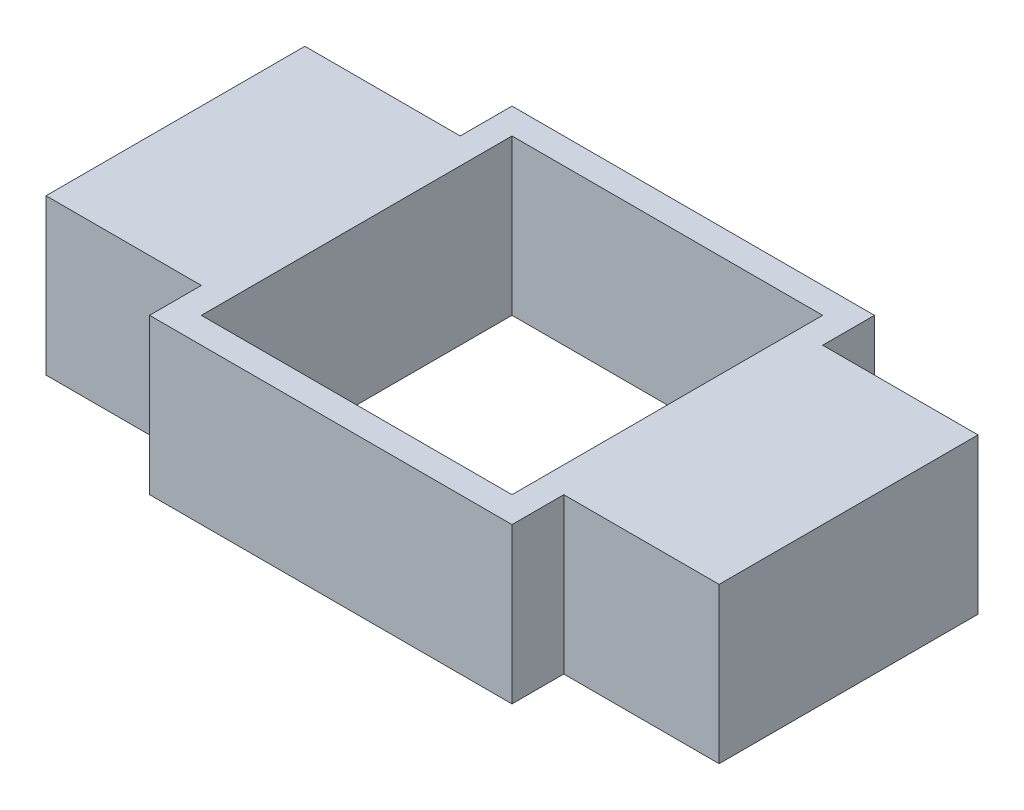
ISO-10303-21;
HEADER;
FILE_DESCRIPTION(('STEP AP214'),'2;1');
FILE_NAME('part.step','',(''),(''),'','','');
FILE_SCHEMA(('AUTOMOTIVE_DESIGN { 1 0 10303 214 1 1 1 1 }'));
ENDSEC;
DATA;
#1=APPLICATION_CONTEXT('core data for automotive mechanical design processes');
#2=APPLICATION_PROTOCOL_DEFINITION('international standard','automotive_design',2000,#1);
#3=PRODUCT_CONTEXT('',#1,'mechanical');
#4=PRODUCT('Part','Part','',(#3));
#5=PRODUCT_RELATED_PRODUCT_CATEGORY('part','',(#4));
#6=PRODUCT_DEFINITION_FORMATION('','',#4);
#7=PRODUCT_DEFINITION_CONTEXT('part definition',#1,'design');
#8=PRODUCT_DEFINITION('design','',#6,#7);
#9=PRODUCT_DEFINITION_SHAPE('','',#8);
#10=(LENGTH_UNIT() NAMED_UNIT(*) SI_UNIT(.MILLI.,.METRE.));
#11=(NAMED_UNIT(*) PLANE_ANGLE_UNIT() SI_UNIT($,.RADIAN.));
#12=(NAMED_UNIT(*) SI_UNIT($,.STERADIAN.) SOLID_ANGLE_UNIT());
#13=UNCERTAINTY_MEASURE_WITH_UNIT(LENGTH_MEASURE(1.E-05),#10,'distance_accuracy_value','');
#14=(GEOMETRIC_REPRESENTATION_CONTEXT(3) GLOBAL_UNCERTAINTY_ASSIGNED_CONTEXT((#13)) GLOBAL_UNIT_ASSIGNED_CONTEXT((#10,
#11,#12)) REPRESENTATION_CONTEXT('',''));
#15=CARTESIAN_POINT('',(0.,0.,0.));
#16=DIRECTION('',(0.,0.,1.));
#17=DIRECTION('',(1.,0.,0.));
#18=AXIS2_PLACEMENT_3D('',#15,#16,#17);
#19=CARTESIAN_POINT('',(-3.5,3.,3.5));
#20=DIRECTION('',(1.,0.,0.));
#21=DIRECTION('',(0.,0.,-1.));
#22=AXIS2_PLACEMENT_3D('',#19,#20,#21);
#23=PLANE('',#22);
#24=DIRECTION('',(0.,1.,0.));
#25=VECTOR('',#24,1.);
#26=CARTESIAN_POINT('',(-3.5,0.,2.5));
#27=LINE('',#26,#25);
#28=CARTESIAN_POINT('',(-3.5,0.,2.5));
#29=VERTEX_POINT('',#28);
#30=CARTESIAN_POINT('',(-3.5,3.,2.5));
#31=VERTEX_POINT('',#30);
#32=EDGE_CURVE('E200',#29,#31,#27,.T.);
#33=ORIENTED_EDGE('',*,*,#32,.F.);
#34=DIRECTION('',(0.,0.,1.));
#35=VECTOR('',#34,1.);
#36=CARTESIAN_POINT('',(-3.5,0.,3.5));
#37=LINE('',#36,#35);
#38=CARTESIAN_POINT('',(-3.5,0.,3.5));
#39=VERTEX_POINT('',#38);
#40=EDGE_CURVE('E202',#29,#39,#37,.T.);
#41=ORIENTED_EDGE('',*,*,#40,.T.);
#42=DIRECTION('',(0.,-1.,0.));
#43=VECTOR('',#42,1.);
#44=CARTESIAN_POINT('',(-3.5,3.,3.5));
#45=LINE('',#44,#43);
#46=CARTESIAN_POINT('',(-3.5,3.,3.5));
#47=VERTEX_POINT('',#46);
#48=EDGE_CURVE('E265',#47,#39,#45,.T.);
#49=ORIENTED_EDGE('',*,*,#48,.F.);
#50=DIRECTION('',(0.,0.,1.));
#51=VECTOR('',#50,1.);
#52=CARTESIAN_POINT('',(-3.5,3.,3.5));
#53=LINE('',#52,#51);
#54=EDGE_CURVE('E237',#31,#47,#53,.T.);
#55=ORIENTED_EDGE('',*,*,#54,.F.);
#56=EDGE_LOOP('',(#33,#41,#49,#55));
#57=FACE_BOUND('',#56,.T.);
#58=ADVANCED_FACE('F39',(#57),#23,.F.);
#59=CARTESIAN_POINT('',(3.5,3.,3.5));
#60=DIRECTION('',(-1.,0.,0.));
#61=DIRECTION('',(0.,0.,1.));
#62=AXIS2_PLACEMENT_3D('',#59,#60,#61);
#63=PLANE('',#62);
#64=DIRECTION('',(0.,1.,0.));
#65=VECTOR('',#64,1.);
#66=CARTESIAN_POINT('',(3.5,0.,-2.5));
#67=LINE('',#66,#65);
#68=CARTESIAN_POINT('',(3.5,0.,-2.5));
#69=VERTEX_POINT('',#68);
#70=CARTESIAN_POINT('',(3.5,3.,-2.5));
#71=VERTEX_POINT('',#70);
#72=EDGE_CURVE('E178',#69,#71,#67,.T.);
#73=ORIENTED_EDGE('',*,*,#72,.F.);
#74=DIRECTION('',(0.,0.,-1.));
#75=VECTOR('',#74,1.);
#76=CARTESIAN_POINT('',(3.5,0.,3.5));
#77=LINE('',#76,#75);
#78=CARTESIAN_POINT('',(3.5,0.,-3.5));
#79=VERTEX_POINT('',#78);
#80=EDGE_CURVE('E251',#69,#79,#77,.T.);
#81=ORIENTED_EDGE('',*,*,#80,.T.);
#82=DIRECTION('',(0.,-1.,0.));
#83=VECTOR('',#82,1.);
#84=CARTESIAN_POINT('',(3.5,3.,-3.5));
#85=LINE('',#84,#83);
#86=CARTESIAN_POINT('',(3.5,3.,-3.5));
#87=VERTEX_POINT('',#86);
#88=EDGE_CURVE('E259',#87,#79,#85,.T.);
#89=ORIENTED_EDGE('',*,*,#88,.F.);
#90=DIRECTION('',(0.,0.,-1.));
#91=VECTOR('',#90,1.);
#92=CARTESIAN_POINT('',(3.5,3.,3.5));
#93=LINE('',#92,#91);
#94=EDGE_CURVE('E239',#71,#87,#93,.T.);
#95=ORIENTED_EDGE('',*,*,#94,.F.);
#96=EDGE_LOOP('',(#73,#81,#89,#95));
#97=FACE_BOUND('',#96,.T.);
#98=ADVANCED_FACE('F293',(#97),#63,.F.);
#99=CARTESIAN_POINT('',(-3.5,0.,-3.5));
#100=VERTEX_POINT('',#99);
#101=CARTESIAN_POINT('',(-3.5,0.,-2.5));
#102=VERTEX_POINT('',#101);
#103=EDGE_CURVE('E246',#100,#102,#37,.T.);
#104=ORIENTED_EDGE('',*,*,#103,.T.);
#105=DIRECTION('',(0.,1.,0.));
#106=VECTOR('',#105,1.);
#107=CARTESIAN_POINT('',(-3.5,0.,-2.5));
#108=LINE('',#107,#106);
#109=CARTESIAN_POINT('',(-3.5,3.,-2.5));
#110=VERTEX_POINT('',#109);
#111=EDGE_CURVE('E190',#102,#110,#108,.T.);
#112=ORIENTED_EDGE('',*,*,#111,.T.);
#113=CARTESIAN_POINT('',(-3.5,3.,-3.5));
#114=VERTEX_POINT('',#113);
#115=EDGE_CURVE('E233',#114,#110,#53,.T.);
#116=ORIENTED_EDGE('',*,*,#115,.F.);
#117=DIRECTION('',(0.,-1.,0.));
#118=VECTOR('',#117,1.);
#119=CARTESIAN_POINT('',(-3.5,3.,-3.5));
#120=LINE('',#119,#118);
#121=EDGE_CURVE('E245',#114,#100,#120,.T.);
#122=ORIENTED_EDGE('',*,*,#121,.T.);
#123=EDGE_LOOP('',(#104,#112,#116,#122));
#124=FACE_BOUND('',#123,.T.);
#125=ADVANCED_FACE('F41',(#124),#23,.F.);
#126=CARTESIAN_POINT('',(3.5,3.,3.5));
#127=DIRECTION('',(0.,0.,-1.));
#128=DIRECTION('',(-1.,0.,0.));
#129=AXIS2_PLACEMENT_3D('',#126,#127,#128);
#130=PLANE('',#129);
#131=DIRECTION('',(1.,0.,0.));
#132=VECTOR('',#131,1.);
#133=CARTESIAN_POINT('',(3.5,0.,3.5));
#134=LINE('',#133,#132);
#135=CARTESIAN_POINT('',(3.5,0.,3.5));
#136=VERTEX_POINT('',#135);
#137=EDGE_CURVE('E249',#39,#136,#134,.T.);
#138=ORIENTED_EDGE('',*,*,#137,.T.);
#139=DIRECTION('',(0.,-1.,0.));
#140=VECTOR('',#139,1.);
#141=CARTESIAN_POINT('',(3.5,3.,3.5));
#142=LINE('',#141,#140);
#143=CARTESIAN_POINT('',(3.5,3.,3.5));
#144=VERTEX_POINT('',#143);
#145=EDGE_CURVE('E262',#144,#136,#142,.T.);
#146=ORIENTED_EDGE('',*,*,#145,.F.);
#147=DIRECTION('',(1.,0.,0.));
#148=VECTOR('',#147,1.);
#149=CARTESIAN_POINT('',(3.5,3.,3.5));
#150=LINE('',#149,#148);
#151=EDGE_CURVE('E236',#47,#144,#150,.T.);
#152=ORIENTED_EDGE('',*,*,#151,.F.);
#153=ORIENTED_EDGE('',*,*,#48,.T.);
#154=EDGE_LOOP('',(#138,#146,#152,#153));
#155=FACE_BOUND('',#154,.T.);
#156=ADVANCED_FACE('F304',(#155),#130,.F.);
#157=CARTESIAN_POINT('',(3.5,0.,2.5));
#158=VERTEX_POINT('',#157);
#159=EDGE_CURVE('E252',#136,#158,#77,.T.);
#160=ORIENTED_EDGE('',*,*,#159,.T.);
#161=DIRECTION('',(0.,1.,0.));
#162=VECTOR('',#161,1.);
#163=CARTESIAN_POINT('',(3.5,0.,2.5));
#164=LINE('',#163,#162);
#165=CARTESIAN_POINT('',(3.5,3.,2.5));
#166=VERTEX_POINT('',#165);
#167=EDGE_CURVE('E209',#158,#166,#164,.T.);
#168=ORIENTED_EDGE('',*,*,#167,.T.);
#169=EDGE_CURVE('E240',#144,#166,#93,.T.);
#170=ORIENTED_EDGE('',*,*,#169,.F.);
#171=ORIENTED_EDGE('',*,*,#145,.T.);
#172=EDGE_LOOP('',(#160,#168,#170,#171));
#173=FACE_BOUND('',#172,.T.);
#174=ADVANCED_FACE('F301',(#173),#63,.F.);
#175=CARTESIAN_POINT('',(3.5,3.,-3.5));
#176=DIRECTION('',(0.,0.,1.));
#177=DIRECTION('',(1.,0.,0.));
#178=AXIS2_PLACEMENT_3D('',#175,#176,#177);
#179=PLANE('',#178);
#180=DIRECTION('',(-1.,0.,0.));
#181=VECTOR('',#180,1.);
#182=CARTESIAN_POINT('',(3.5,0.,-3.5));
#183=LINE('',#182,#181);
#184=EDGE_CURVE('E255',#79,#100,#183,.T.);
#185=ORIENTED_EDGE('',*,*,#184,.T.);
#186=ORIENTED_EDGE('',*,*,#121,.F.);
#187=DIRECTION('',(-1.,0.,0.));
#188=VECTOR('',#187,1.);
#189=CARTESIAN_POINT('',(3.5,3.,-3.5));
#190=LINE('',#189,#188);
#191=EDGE_CURVE('E243',#87,#114,#190,.T.);
#192=ORIENTED_EDGE('',*,*,#191,.F.);
#193=ORIENTED_EDGE('',*,*,#88,.T.);
#194=EDGE_LOOP('',(#185,#186,#192,#193));
#195=FACE_BOUND('',#194,.T.);
#196=ADVANCED_FACE('F325',(#195),#179,.F.);
#197=CARTESIAN_POINT('',(0.,3.,0.));
#198=DIRECTION('',(0.,1.,0.));
#199=DIRECTION('',(0.,0.,1.));
#200=AXIS2_PLACEMENT_3D('',#197,#198,#199);
#201=PLANE('',#200);
#202=DIRECTION('',(0.,0.,1.));
#203=VECTOR('',#202,1.);
#204=CARTESIAN_POINT('',(-3.,3.,3.));
#205=LINE('',#204,#203);
#206=CARTESIAN_POINT('',(-3.,3.,-3.));
#207=VERTEX_POINT('',#206);
#208=CARTESIAN_POINT('',(-3.,3.,3.));
#209=VERTEX_POINT('',#208);
#210=EDGE_CURVE('E54',#207,#209,#205,.T.);
#211=ORIENTED_EDGE('',*,*,#210,.F.);
#212=DIRECTION('',(-1.,0.,0.));
#213=VECTOR('',#212,1.);
#214=CARTESIAN_POINT('',(3.,3.,-3.));
#215=LINE('',#214,#213);
#216=CARTESIAN_POINT('',(3.,3.,-3.));
#217=VERTEX_POINT('',#216);
#218=EDGE_CURVE('E171',#217,#207,#215,.T.);
#219=ORIENTED_EDGE('',*,*,#218,.F.);
#220=DIRECTION('',(0.,0.,-1.));
#221=VECTOR('',#220,1.);
#222=CARTESIAN_POINT('',(3.,3.,3.));
#223=LINE('',#222,#221);
#224=CARTESIAN_POINT('',(3.,3.,3.));
#225=VERTEX_POINT('',#224);
#226=EDGE_CURVE('E155',#225,#217,#223,.T.);
#227=ORIENTED_EDGE('',*,*,#226,.F.);
#228=DIRECTION('',(1.,0.,0.));
#229=VECTOR('',#228,1.);
#230=CARTESIAN_POINT('',(3.,3.,3.));
#231=LINE('',#230,#229);
#232=EDGE_CURVE('E164',#209,#225,#231,.T.);
#233=ORIENTED_EDGE('',*,*,#232,.F.);
#234=EDGE_LOOP('',(#211,#219,#227,#233));
#235=FACE_BOUND('',#234,.T.);
#236=ORIENTED_EDGE('',*,*,#115,.T.);
#237=DIRECTION('',(-1.,0.,0.));
#238=VECTOR('',#237,1.);
#239=CARTESIAN_POINT('',(-3.5,3.,-2.5));
#240=LINE('',#239,#238);
#241=CARTESIAN_POINT('',(-6.5,3.,-2.5));
#242=VERTEX_POINT('',#241);
#243=EDGE_CURVE('E191',#110,#242,#240,.T.);
#244=ORIENTED_EDGE('',*,*,#243,.T.);
#245=DIRECTION('',(0.,0.,1.));
#246=VECTOR('',#245,1.);
#247=CARTESIAN_POINT('',(-6.5,3.,-2.5));
#248=LINE('',#247,#246);
#249=CARTESIAN_POINT('',(-6.5,3.,2.5));
#250=VERTEX_POINT('',#249);
#251=EDGE_CURVE('E194',#242,#250,#248,.T.);
#252=ORIENTED_EDGE('',*,*,#251,.T.);
#253=DIRECTION('',(1.,0.,0.));
#254=VECTOR('',#253,1.);
#255=CARTESIAN_POINT('',(-3.5,3.,2.5));
#256=LINE('',#255,#254);
#257=EDGE_CURVE('E185',#250,#31,#256,.T.);
#258=ORIENTED_EDGE('',*,*,#257,.T.);
#259=ORIENTED_EDGE('',*,*,#54,.T.);
#260=ORIENTED_EDGE('',*,*,#151,.T.);
#261=ORIENTED_EDGE('',*,*,#169,.T.);
#262=DIRECTION('',(1.,0.,0.));
#263=VECTOR('',#262,1.);
#264=CARTESIAN_POINT('',(3.5,3.,2.5));
#265=LINE('',#264,#263);
#266=CARTESIAN_POINT('',(6.5,3.,2.5));
#267=VERTEX_POINT('',#266);
#268=EDGE_CURVE('E195',#166,#267,#265,.T.);
#269=ORIENTED_EDGE('',*,*,#268,.T.);
#270=DIRECTION('',(0.,0.,-1.));
#271=VECTOR('',#270,1.);
#272=CARTESIAN_POINT('',(6.5,3.,-2.5));
#273=LINE('',#272,#271);
#274=CARTESIAN_POINT('',(6.5,3.,-2.5));
#275=VERTEX_POINT('',#274);
#276=EDGE_CURVE('E221',#267,#275,#273,.T.);
#277=ORIENTED_EDGE('',*,*,#276,.T.);
#278=DIRECTION('',(-1.,0.,0.));
#279=VECTOR('',#278,1.);
#280=CARTESIAN_POINT('',(3.5,3.,-2.5));
#281=LINE('',#280,#279);
#282=EDGE_CURVE('E218',#275,#71,#281,.T.);
#283=ORIENTED_EDGE('',*,*,#282,.T.);
#284=ORIENTED_EDGE('',*,*,#94,.T.);
#285=ORIENTED_EDGE('',*,*,#191,.T.);
#286=EDGE_LOOP('',(#236,#244,#252,#258,#259,#260,#261,#269,#277,#283,#284,#285));
#287=FACE_BOUND('',#286,.T.);
#288=ADVANCED_FACE('F168',(#235,#287),#201,.T.);
#289=CARTESIAN_POINT('',(0.,0.,0.));
#290=DIRECTION('',(0.,1.,0.));
#291=DIRECTION('',(0.,0.,1.));
#292=AXIS2_PLACEMENT_3D('',#289,#290,#291);
#293=PLANE('',#292);
#294=DIRECTION('',(-1.,0.,0.));
#295=VECTOR('',#294,1.);
#296=CARTESIAN_POINT('',(0.,0.,-3.));
#297=LINE('',#296,#295);
#298=CARTESIAN_POINT('',(3.,0.,-3.));
#299=VERTEX_POINT('',#298);
#300=CARTESIAN_POINT('',(-3.,0.,-3.));
#301=VERTEX_POINT('',#300);
#302=EDGE_CURVE('E47',#299,#301,#297,.T.);
#303=ORIENTED_EDGE('',*,*,#302,.T.);
#304=DIRECTION('',(0.,0.,1.));
#305=VECTOR('',#304,1.);
#306=CARTESIAN_POINT('',(-3.,0.,0.));
#307=LINE('',#306,#305);
#308=CARTESIAN_POINT('',(-3.,0.,3.));
#309=VERTEX_POINT('',#308);
#310=EDGE_CURVE('E11',#301,#309,#307,.T.);
#311=ORIENTED_EDGE('',*,*,#310,.T.);
#312=DIRECTION('',(1.,0.,0.));
#313=VECTOR('',#312,1.);
#314=CARTESIAN_POINT('',(0.,0.,3.));
#315=LINE('',#314,#313);
#316=CARTESIAN_POINT('',(3.,0.,3.));
#317=VERTEX_POINT('',#316);
#318=EDGE_CURVE('E268',#309,#317,#315,.T.);
#319=ORIENTED_EDGE('',*,*,#318,.T.);
#320=DIRECTION('',(0.,0.,-1.));
#321=VECTOR('',#320,1.);
#322=CARTESIAN_POINT('',(3.,0.,0.));
#323=LINE('',#322,#321);
#324=EDGE_CURVE('E158',#317,#299,#323,.T.);
#325=ORIENTED_EDGE('',*,*,#324,.T.);
#326=EDGE_LOOP('',(#303,#311,#319,#325));
#327=FACE_BOUND('',#326,.T.);
#328=ORIENTED_EDGE('',*,*,#103,.F.);
#329=ORIENTED_EDGE('',*,*,#184,.F.);
#330=ORIENTED_EDGE('',*,*,#80,.F.);
#331=DIRECTION('',(-1.,0.,0.));
#332=VECTOR('',#331,1.);
#333=CARTESIAN_POINT('',(3.5,0.,-2.5));
#334=LINE('',#333,#332);
#335=CARTESIAN_POINT('',(6.5,0.,-2.5));
#336=VERTEX_POINT('',#335);
#337=EDGE_CURVE('E212',#336,#69,#334,.T.);
#338=ORIENTED_EDGE('',*,*,#337,.F.);
#339=DIRECTION('',(0.,0.,-1.));
#340=VECTOR('',#339,1.);
#341=CARTESIAN_POINT('',(6.5,0.,-2.5));
#342=LINE('',#341,#340);
#343=CARTESIAN_POINT('',(6.5,0.,2.5));
#344=VERTEX_POINT('',#343);
#345=EDGE_CURVE('E228',#344,#336,#342,.T.);
#346=ORIENTED_EDGE('',*,*,#345,.F.);
#347=DIRECTION('',(1.,0.,0.));
#348=VECTOR('',#347,1.);
#349=CARTESIAN_POINT('',(3.5,0.,2.5));
#350=LINE('',#349,#348);
#351=EDGE_CURVE('E222',#158,#344,#350,.T.);
#352=ORIENTED_EDGE('',*,*,#351,.F.);
#353=ORIENTED_EDGE('',*,*,#159,.F.);
#354=ORIENTED_EDGE('',*,*,#137,.F.);
#355=ORIENTED_EDGE('',*,*,#40,.F.);
#356=DIRECTION('',(1.,0.,0.));
#357=VECTOR('',#356,1.);
#358=CARTESIAN_POINT('',(-3.5,0.,2.5));
#359=LINE('',#358,#357);
#360=CARTESIAN_POINT('',(-6.5,0.,2.5));
#361=VERTEX_POINT('',#360);
#362=EDGE_CURVE('E188',#361,#29,#359,.T.);
#363=ORIENTED_EDGE('',*,*,#362,.F.);
#364=DIRECTION('',(0.,0.,1.));
#365=VECTOR('',#364,1.);
#366=CARTESIAN_POINT('',(-6.5,0.,-2.5));
#367=LINE('',#366,#365);
#368=CARTESIAN_POINT('',(-6.5,0.,-2.5));
#369=VERTEX_POINT('',#368);
#370=EDGE_CURVE('E184',#369,#361,#367,.T.);
#371=ORIENTED_EDGE('',*,*,#370,.F.);
#372=DIRECTION('',(-1.,0.,0.));
#373=VECTOR('',#372,1.);
#374=CARTESIAN_POINT('',(-3.5,0.,-2.5));
#375=LINE('',#374,#373);
#376=EDGE_CURVE('E181',#102,#369,#375,.T.);
#377=ORIENTED_EDGE('',*,*,#376,.F.);
#378=EDGE_LOOP('',(#328,#329,#330,#338,#346,#352,#353,#354,#355,#363,#371,#377));
#379=FACE_BOUND('',#378,.T.);
#380=ADVANCED_FACE('F272',(#327,#379),#293,.F.);
#381=CARTESIAN_POINT('',(3.5,0.,-2.5));
#382=DIRECTION('',(0.,0.,-1.));
#383=DIRECTION('',(-1.,0.,0.));
#384=AXIS2_PLACEMENT_3D('',#381,#382,#383);
#385=PLANE('',#384);
#386=ORIENTED_EDGE('',*,*,#282,.F.);
#387=DIRECTION('',(0.,1.,0.));
#388=VECTOR('',#387,1.);
#389=CARTESIAN_POINT('',(6.5,0.,-2.5));
#390=LINE('',#389,#388);
#391=EDGE_CURVE('E215',#336,#275,#390,.T.);
#392=ORIENTED_EDGE('',*,*,#391,.F.);
#393=ORIENTED_EDGE('',*,*,#337,.T.);
#394=ORIENTED_EDGE('',*,*,#72,.T.);
#395=EDGE_LOOP('',(#386,#392,#393,#394));
#396=FACE_BOUND('',#395,.T.);
#397=ADVANCED_FACE('F332',(#396),#385,.T.);
#398=CARTESIAN_POINT('',(6.5,0.,-2.5));
#399=DIRECTION('',(1.,0.,0.));
#400=DIRECTION('',(0.,0.,-1.));
#401=AXIS2_PLACEMENT_3D('',#398,#399,#400);
#402=PLANE('',#401);
#403=ORIENTED_EDGE('',*,*,#276,.F.);
#404=DIRECTION('',(0.,1.,0.));
#405=VECTOR('',#404,1.);
#406=CARTESIAN_POINT('',(6.5,0.,2.5));
#407=LINE('',#406,#405);
#408=EDGE_CURVE('E213',#344,#267,#407,.T.);
#409=ORIENTED_EDGE('',*,*,#408,.F.);
#410=ORIENTED_EDGE('',*,*,#345,.T.);
#411=ORIENTED_EDGE('',*,*,#391,.T.);
#412=EDGE_LOOP('',(#403,#409,#410,#411));
#413=FACE_BOUND('',#412,.T.);
#414=ADVANCED_FACE('F335',(#413),#402,.T.);
#415=CARTESIAN_POINT('',(3.5,0.,2.5));
#416=DIRECTION('',(0.,0.,1.));
#417=DIRECTION('',(1.,0.,0.));
#418=AXIS2_PLACEMENT_3D('',#415,#416,#417);
#419=PLANE('',#418);
#420=ORIENTED_EDGE('',*,*,#268,.F.);
#421=ORIENTED_EDGE('',*,*,#167,.F.);
#422=ORIENTED_EDGE('',*,*,#351,.T.);
#423=ORIENTED_EDGE('',*,*,#408,.T.);
#424=EDGE_LOOP('',(#420,#421,#422,#423));
#425=FACE_BOUND('',#424,.T.);
#426=ADVANCED_FACE('F337',(#425),#419,.T.);
#427=CARTESIAN_POINT('',(-3.5,0.,2.5));
#428=DIRECTION('',(0.,0.,1.));
#429=DIRECTION('',(1.,0.,0.));
#430=AXIS2_PLACEMENT_3D('',#427,#428,#429);
#431=PLANE('',#430);
#432=ORIENTED_EDGE('',*,*,#257,.F.);
#433=DIRECTION('',(0.,1.,0.));
#434=VECTOR('',#433,1.);
#435=CARTESIAN_POINT('',(-6.5,0.,2.5));
#436=LINE('',#435,#434);
#437=EDGE_CURVE('E203',#361,#250,#436,.T.);
#438=ORIENTED_EDGE('',*,*,#437,.F.);
#439=ORIENTED_EDGE('',*,*,#362,.T.);
#440=ORIENTED_EDGE('',*,*,#32,.T.);
#441=EDGE_LOOP('',(#432,#438,#439,#440));
#442=FACE_BOUND('',#441,.T.);
#443=ADVANCED_FACE('F348',(#442),#431,.T.);
#444=CARTESIAN_POINT('',(-6.5,0.,-2.5));
#445=DIRECTION('',(-1.,0.,0.));
#446=DIRECTION('',(0.,0.,1.));
#447=AXIS2_PLACEMENT_3D('',#444,#445,#446);
#448=PLANE('',#447);
#449=ORIENTED_EDGE('',*,*,#251,.F.);
#450=DIRECTION('',(0.,1.,0.));
#451=VECTOR('',#450,1.);
#452=CARTESIAN_POINT('',(-6.5,0.,-2.5));
#453=LINE('',#452,#451);
#454=EDGE_CURVE('E205',#369,#242,#453,.T.);
#455=ORIENTED_EDGE('',*,*,#454,.F.);
#456=ORIENTED_EDGE('',*,*,#370,.T.);
#457=ORIENTED_EDGE('',*,*,#437,.T.);
#458=EDGE_LOOP('',(#449,#455,#456,#457));
#459=FACE_BOUND('',#458,.T.);
#460=ADVANCED_FACE('F287',(#459),#448,.T.);
#461=CARTESIAN_POINT('',(-3.5,0.,-2.5));
#462=DIRECTION('',(0.,0.,-1.));
#463=DIRECTION('',(-1.,0.,0.));
#464=AXIS2_PLACEMENT_3D('',#461,#462,#463);
#465=PLANE('',#464);
#466=ORIENTED_EDGE('',*,*,#243,.F.);
#467=ORIENTED_EDGE('',*,*,#111,.F.);
#468=ORIENTED_EDGE('',*,*,#376,.T.);
#469=ORIENTED_EDGE('',*,*,#454,.T.);
#470=EDGE_LOOP('',(#466,#467,#468,#469));
#471=FACE_BOUND('',#470,.T.);
#472=ADVANCED_FACE('F279',(#471),#465,.T.);
#473=CARTESIAN_POINT('',(-3.,-7.,3.));
#474=DIRECTION('',(-1.,0.,0.));
#475=DIRECTION('',(0.,0.,1.));
#476=AXIS2_PLACEMENT_3D('',#473,#474,#475);
#477=PLANE('',#476);
#478=DIRECTION('',(0.,1.,0.));
#479=VECTOR('',#478,1.);
#480=CARTESIAN_POINT('',(-3.,-7.,-3.));
#481=LINE('',#480,#479);
#482=EDGE_CURVE('E176',#301,#207,#481,.T.);
#483=ORIENTED_EDGE('',*,*,#482,.T.);
#484=ORIENTED_EDGE('',*,*,#210,.T.);
#485=DIRECTION('',(0.,1.,0.));
#486=VECTOR('',#485,1.);
#487=CARTESIAN_POINT('',(-3.,-7.,3.));
#488=LINE('',#487,#486);
#489=EDGE_CURVE('E161',#309,#209,#488,.T.);
#490=ORIENTED_EDGE('',*,*,#489,.F.);
#491=ORIENTED_EDGE('',*,*,#310,.F.);
#492=EDGE_LOOP('',(#483,#484,#490,#491));
#493=FACE_BOUND('',#492,.T.);
#494=ADVANCED_FACE('F277',(#493),#477,.F.);
#495=CARTESIAN_POINT('',(3.,-7.,-3.));
#496=DIRECTION('',(0.,0.,-1.));
#497=DIRECTION('',(-1.,0.,0.));
#498=AXIS2_PLACEMENT_3D('',#495,#496,#497);
#499=PLANE('',#498);
#500=DIRECTION('',(0.,1.,0.));
#501=VECTOR('',#500,1.);
#502=CARTESIAN_POINT('',(3.,-7.,-3.));
#503=LINE('',#502,#501);
#504=EDGE_CURVE('E160',#299,#217,#503,.T.);
#505=ORIENTED_EDGE('',*,*,#504,.T.);
#506=ORIENTED_EDGE('',*,*,#218,.T.);
#507=ORIENTED_EDGE('',*,*,#482,.F.);
#508=ORIENTED_EDGE('',*,*,#302,.F.);
#509=EDGE_LOOP('',(#505,#506,#507,#508));
#510=FACE_BOUND('',#509,.T.);
#511=ADVANCED_FACE('F276',(#510),#499,.F.);
#512=CARTESIAN_POINT('',(3.,-7.,3.));
#513=DIRECTION('',(1.,0.,0.));
#514=DIRECTION('',(0.,0.,-1.));
#515=AXIS2_PLACEMENT_3D('',#512,#513,#514);
#516=PLANE('',#515);
#517=DIRECTION('',(0.,1.,0.));
#518=VECTOR('',#517,1.);
#519=CARTESIAN_POINT('',(3.,-7.,3.));
#520=LINE('',#519,#518);
#521=EDGE_CURVE('E62',#317,#225,#520,.T.);
#522=ORIENTED_EDGE('',*,*,#521,.T.);
#523=ORIENTED_EDGE('',*,*,#226,.T.);
#524=ORIENTED_EDGE('',*,*,#504,.F.);
#525=ORIENTED_EDGE('',*,*,#324,.F.);
#526=EDGE_LOOP('',(#522,#523,#524,#525));
#527=FACE_BOUND('',#526,.T.);
#528=ADVANCED_FACE('F152',(#527),#516,.F.);
#529=CARTESIAN_POINT('',(3.,-7.,3.));
#530=DIRECTION('',(0.,0.,1.));
#531=DIRECTION('',(1.,0.,0.));
#532=AXIS2_PLACEMENT_3D('',#529,#530,#531);
#533=PLANE('',#532);
#534=ORIENTED_EDGE('',*,*,#489,.T.);
#535=ORIENTED_EDGE('',*,*,#232,.T.);
#536=ORIENTED_EDGE('',*,*,#521,.F.);
#537=ORIENTED_EDGE('',*,*,#318,.F.);
#538=EDGE_LOOP('',(#534,#535,#536,#537));
#539=FACE_BOUND('',#538,.T.);
#540=ADVANCED_FACE('F165',(#539),#533,.F.);
#541=CLOSED_SHELL('',(#58,#98,#125,#156,#174,#196,#288,#380,#397,#414,#426,#443,#460,#472,#494,
#511,#528,#540));
#542=MANIFOLD_SOLID_BREP('B2',#541);
#543=ADVANCED_BREP_SHAPE_REPRESENTATION('',(#18,#542),#14);
#544=SHAPE_DEFINITION_REPRESENTATION(#9,#543);
ENDSEC;
END-ISO-10303-21;
